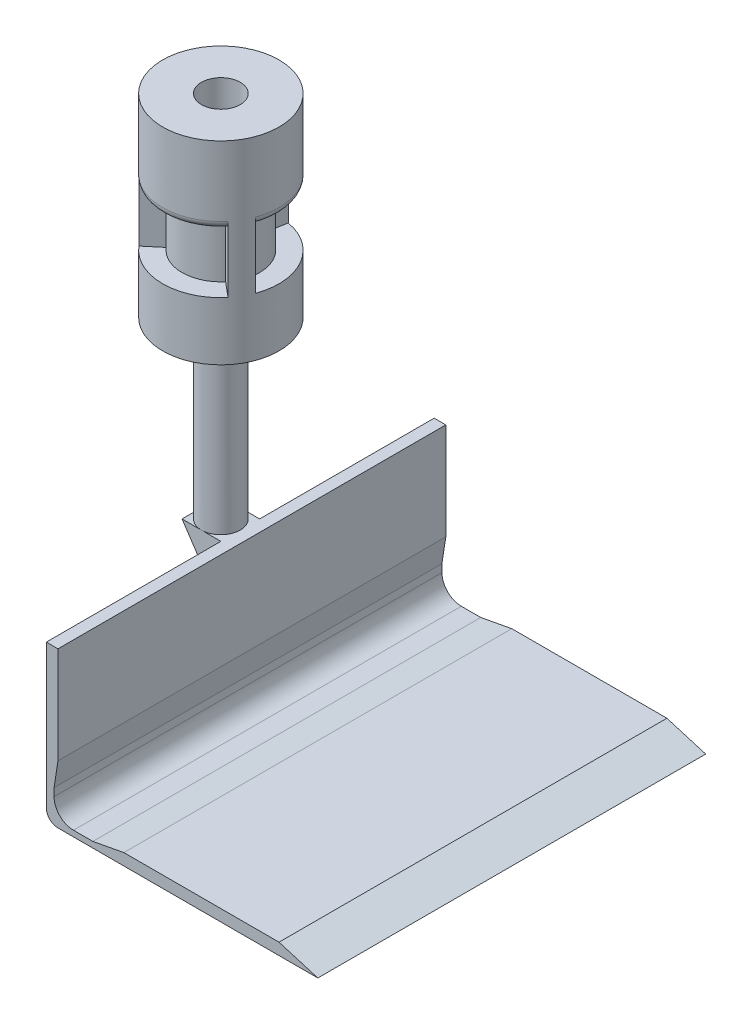
ISO-10303-21;
HEADER;
FILE_DESCRIPTION(('STEP AP214'),'2;1');
FILE_NAME('part.step','',(''),(''),'','','');
FILE_SCHEMA(('AUTOMOTIVE_DESIGN { 1 0 10303 214 1 1 1 1 }'));
ENDSEC;
DATA;
#1=APPLICATION_CONTEXT('core data for automotive mechanical design processes');
#2=APPLICATION_PROTOCOL_DEFINITION('international standard','automotive_design',2000,#1);
#3=PRODUCT_CONTEXT('',#1,'mechanical');
#4=PRODUCT('Part','Part','',(#3));
#5=PRODUCT_RELATED_PRODUCT_CATEGORY('part','',(#4));
#6=PRODUCT_DEFINITION_FORMATION('','',#4);
#7=PRODUCT_DEFINITION_CONTEXT('part definition',#1,'design');
#8=PRODUCT_DEFINITION('design','',#6,#7);
#9=PRODUCT_DEFINITION_SHAPE('','',#8);
#10=(LENGTH_UNIT() NAMED_UNIT(*) SI_UNIT(.MILLI.,.METRE.));
#11=(NAMED_UNIT(*) PLANE_ANGLE_UNIT() SI_UNIT($,.RADIAN.));
#12=(NAMED_UNIT(*) SI_UNIT($,.STERADIAN.) SOLID_ANGLE_UNIT());
#13=UNCERTAINTY_MEASURE_WITH_UNIT(LENGTH_MEASURE(1.E-05),#10,'distance_accuracy_value','');
#14=(GEOMETRIC_REPRESENTATION_CONTEXT(3) GLOBAL_UNCERTAINTY_ASSIGNED_CONTEXT((#13)) GLOBAL_UNIT_ASSIGNED_CONTEXT((#10,
#11,#12)) REPRESENTATION_CONTEXT('',''));
#15=CARTESIAN_POINT('',(0.,0.,0.));
#16=DIRECTION('',(0.,0.,1.));
#17=DIRECTION('',(1.,0.,0.));
#18=AXIS2_PLACEMENT_3D('',#15,#16,#17);
#19=CARTESIAN_POINT('',(7.,100.,0.));
#20=DIRECTION('',(0.,1.,0.));
#21=DIRECTION('',(0.,0.,1.));
#22=AXIS2_PLACEMENT_3D('',#19,#20,#21);
#23=PLANE('',#22);
#24=CARTESIAN_POINT('',(-8.,100.,0.));
#25=DIRECTION('',(0.,-1.,0.));
#26=DIRECTION('',(0.,0.,-1.));
#27=AXIS2_PLACEMENT_3D('',#24,#25,#26);
#28=CIRCLE('',#27,15.);
#29=CARTESIAN_POINT('',(-22.0953893117886,100.,5.1303021498851));
#30=VERTEX_POINT('',#29);
#31=CARTESIAN_POINT('',(-10.604722665004,100.,-14.7721162951831));
#32=VERTEX_POINT('',#31);
#33=EDGE_CURVE('E265',#30,#32,#28,.T.);
#34=ORIENTED_EDGE('',*,*,#33,.F.);
#35=DIRECTION('',(-0.939692620785905,0.,0.342020143325678));
#36=VECTOR('',#35,1.);
#37=CARTESIAN_POINT('',(-15.0476946558945,100.,2.56515107494258));
#38=LINE('',#37,#36);
#39=CARTESIAN_POINT('',(-17.3969262078591,100.,3.42020143325671));
#40=VERTEX_POINT('',#39);
#41=EDGE_CURVE('E249',#40,#30,#38,.T.);
#42=ORIENTED_EDGE('',*,*,#41,.F.);
#43=CARTESIAN_POINT('',(-8.,100.,0.));
#44=DIRECTION('',(0.,-1.,0.));
#45=DIRECTION('',(0.,0.,-1.));
#46=AXIS2_PLACEMENT_3D('',#43,#44,#45);
#47=CIRCLE('',#46,10.);
#48=CARTESIAN_POINT('',(-9.73648177666931,100.,-9.84807753012208));
#49=VERTEX_POINT('',#48);
#50=EDGE_CURVE('E482',#40,#49,#47,.T.);
#51=ORIENTED_EDGE('',*,*,#50,.T.);
#52=DIRECTION('',(0.173648177666931,0.,0.984807753012208));
#53=VECTOR('',#52,1.);
#54=CARTESIAN_POINT('',(-9.30236133250201,100.,-7.38605814759174));
#55=LINE('',#54,#53);
#56=EDGE_CURVE('E525',#32,#49,#55,.T.);
#57=ORIENTED_EDGE('',*,*,#56,.F.);
#58=EDGE_LOOP('',(#34,#42,#51,#57));
#59=FACE_BOUND('',#58,.T.);
#60=ADVANCED_FACE('F33',(#59),#23,.T.);
#61=CARTESIAN_POINT('',(-0.339555568810034,100.,6.42787609686517));
#62=VERTEX_POINT('',#61);
#63=CARTESIAN_POINT('',(-15.6604444311896,100.,6.42787609686556));
#64=VERTEX_POINT('',#63);
#65=EDGE_CURVE('E258',#62,#64,#47,.T.);
#66=ORIENTED_EDGE('',*,*,#65,.T.);
#67=DIRECTION('',(0.766044443118984,0.,-0.642787609686532));
#68=VECTOR('',#67,1.);
#69=CARTESIAN_POINT('',(-13.7453333233921,100.,4.82090707264913));
#70=LINE('',#69,#68);
#71=CARTESIAN_POINT('',(-19.4906666467844,100.,9.64181414529812));
#72=VERTEX_POINT('',#71);
#73=EDGE_CURVE('E240',#72,#64,#70,.T.);
#74=ORIENTED_EDGE('',*,*,#73,.F.);
#75=CARTESIAN_POINT('',(3.49066664678484,100.,9.64181414529789));
#76=VERTEX_POINT('',#75);
#77=EDGE_CURVE('E256',#76,#72,#28,.T.);
#78=ORIENTED_EDGE('',*,*,#77,.F.);
#79=DIRECTION('',(0.766044443118975,0.,0.642787609686544));
#80=VECTOR('',#79,1.);
#81=CARTESIAN_POINT('',(-2.25466667660742,100.,4.82090707264885));
#82=LINE('',#81,#80);
#83=EDGE_CURVE('E540',#62,#76,#82,.T.);
#84=ORIENTED_EDGE('',*,*,#83,.F.);
#85=EDGE_LOOP('',(#66,#74,#78,#84));
#86=FACE_BOUND('',#85,.T.);
#87=ADVANCED_FACE('F254',(#86),#23,.T.);
#88=CARTESIAN_POINT('',(-8.,85.,0.));
#89=DIRECTION('',(0.,-1.,0.));
#90=DIRECTION('',(0.,0.,-1.));
#91=AXIS2_PLACEMENT_3D('',#88,#89,#90);
#92=CYLINDRICAL_SURFACE('',#91,10.);
#93=ORIENTED_EDGE('',*,*,#50,.F.);
#94=DIRECTION('',(0.,-1.,0.));
#95=VECTOR('',#94,1.);
#96=CARTESIAN_POINT('',(-17.3969262078591,85.,3.42020143325671));
#97=LINE('',#96,#95);
#98=CARTESIAN_POINT('',(-17.3969262078591,115.,3.42020143325671));
#99=VERTEX_POINT('',#98);
#100=EDGE_CURVE('E546',#99,#40,#97,.T.);
#101=ORIENTED_EDGE('',*,*,#100,.F.);
#102=CARTESIAN_POINT('',(-8.,115.,0.));
#103=DIRECTION('',(0.,-1.,0.));
#104=DIRECTION('',(0.,0.,-1.));
#105=AXIS2_PLACEMENT_3D('',#102,#103,#104);
#106=CIRCLE('',#105,10.);
#107=CARTESIAN_POINT('',(-9.73648177666931,115.,-9.84807753012208));
#108=VERTEX_POINT('',#107);
#109=EDGE_CURVE('E490',#99,#108,#106,.T.);
#110=ORIENTED_EDGE('',*,*,#109,.T.);
#111=DIRECTION('',(0.,-1.,0.));
#112=VECTOR('',#111,1.);
#113=CARTESIAN_POINT('',(-9.73648177666931,85.,-9.84807753012208));
#114=LINE('',#113,#112);
#115=EDGE_CURVE('E514',#49,#108,#114,.F.);
#116=ORIENTED_EDGE('',*,*,#115,.F.);
#117=EDGE_LOOP('',(#93,#101,#110,#116));
#118=FACE_BOUND('',#117,.T.);
#119=ADVANCED_FACE('F455',(#118),#92,.T.);
#120=CARTESIAN_POINT('',(-0.339555568810035,115.,6.42787609686517));
#121=VERTEX_POINT('',#120);
#122=CARTESIAN_POINT('',(-15.6604444311896,115.,6.42787609686556));
#123=VERTEX_POINT('',#122);
#124=EDGE_CURVE('E489',#121,#123,#106,.T.);
#125=ORIENTED_EDGE('',*,*,#124,.T.);
#126=DIRECTION('',(0.,-1.,0.));
#127=VECTOR('',#126,1.);
#128=CARTESIAN_POINT('',(-15.6604444311896,85.,6.42787609686556));
#129=LINE('',#128,#127);
#130=EDGE_CURVE('E549',#64,#123,#129,.F.);
#131=ORIENTED_EDGE('',*,*,#130,.F.);
#132=ORIENTED_EDGE('',*,*,#65,.F.);
#133=DIRECTION('',(0.,-1.,0.));
#134=VECTOR('',#133,1.);
#135=CARTESIAN_POINT('',(-0.339555568810035,85.,6.42787609686517));
#136=LINE('',#135,#134);
#137=EDGE_CURVE('E531',#121,#62,#136,.T.);
#138=ORIENTED_EDGE('',*,*,#137,.F.);
#139=EDGE_LOOP('',(#125,#131,#132,#138));
#140=FACE_BOUND('',#139,.T.);
#141=ADVANCED_FACE('F469',(#140),#92,.T.);
#142=CARTESIAN_POINT('',(7.,115.,0.));
#143=DIRECTION('',(0.,-1.,0.));
#144=DIRECTION('',(0.,0.,-1.));
#145=AXIS2_PLACEMENT_3D('',#142,#143,#144);
#146=PLANE('',#145);
#147=DIRECTION('',(0.939692620785905,0.,-0.342020143325678));
#148=VECTOR('',#147,1.);
#149=CARTESIAN_POINT('',(-15.0476946558945,115.,2.56515107494258));
#150=LINE('',#149,#148);
#151=CARTESIAN_POINT('',(-20.2160040702168,115.,4.44626186323375));
#152=VERTEX_POINT('',#151);
#153=EDGE_CURVE('E543',#152,#99,#150,.T.);
#154=ORIENTED_EDGE('',*,*,#153,.F.);
#155=CARTESIAN_POINT('',(-8.,115.,0.));
#156=DIRECTION('',(0.,-1.,0.));
#157=DIRECTION('',(0.,0.,-1.));
#158=AXIS2_PLACEMENT_3D('',#155,#156,#157);
#159=CIRCLE('',#158,13.);
#160=CARTESIAN_POINT('',(-10.2574263096701,115.,-12.8025007891587));
#161=VERTEX_POINT('',#160);
#162=EDGE_CURVE('E396',#152,#161,#159,.T.);
#163=ORIENTED_EDGE('',*,*,#162,.T.);
#164=DIRECTION('',(-0.173648177666931,0.,-0.984807753012208));
#165=VECTOR('',#164,1.);
#166=CARTESIAN_POINT('',(-9.30236133250201,115.,-7.38605814759174));
#167=LINE('',#166,#165);
#168=EDGE_CURVE('E513',#108,#161,#167,.T.);
#169=ORIENTED_EDGE('',*,*,#168,.F.);
#170=ORIENTED_EDGE('',*,*,#109,.F.);
#171=EDGE_LOOP('',(#154,#163,#169,#170));
#172=FACE_BOUND('',#171,.T.);
#173=ADVANCED_FACE('F470',(#172),#146,.T.);
#174=DIRECTION('',(-0.766044443118975,0.,-0.642787609686544));
#175=VECTOR('',#174,1.);
#176=CARTESIAN_POINT('',(-2.25466667660742,115.,4.82090707264885));
#177=LINE('',#176,#175);
#178=CARTESIAN_POINT('',(1.9585777605469,115.,8.3562389259248));
#179=VERTEX_POINT('',#178);
#180=EDGE_CURVE('E528',#179,#121,#177,.T.);
#181=ORIENTED_EDGE('',*,*,#180,.F.);
#182=CARTESIAN_POINT('',(-8.,115.,0.));
#183=DIRECTION('',(0.,-1.,0.));
#184=DIRECTION('',(0.,0.,-1.));
#185=AXIS2_PLACEMENT_3D('',#182,#183,#184);
#186=CIRCLE('',#185,13.);
#187=CARTESIAN_POINT('',(-17.9585777605466,115.,8.35623892592517));
#188=VERTEX_POINT('',#187);
#189=EDGE_CURVE('E399',#179,#188,#186,.T.);
#190=ORIENTED_EDGE('',*,*,#189,.T.);
#191=DIRECTION('',(-0.766044443118984,0.,0.642787609686533));
#192=VECTOR('',#191,1.);
#193=CARTESIAN_POINT('',(-13.7453333233921,115.,4.82090707264913));
#194=LINE('',#193,#192);
#195=EDGE_CURVE('E548',#123,#188,#194,.T.);
#196=ORIENTED_EDGE('',*,*,#195,.F.);
#197=ORIENTED_EDGE('',*,*,#124,.F.);
#198=EDGE_LOOP('',(#181,#190,#196,#197));
#199=FACE_BOUND('',#198,.T.);
#200=ADVANCED_FACE('F461',(#199),#146,.T.);
#201=CARTESIAN_POINT('',(-6.2635182233307,100.,-9.84807753012208));
#202=VERTEX_POINT('',#201);
#203=CARTESIAN_POINT('',(1.39692620785917,100.,3.42020143325643));
#204=VERTEX_POINT('',#203);
#205=EDGE_CURVE('E269',#202,#204,#47,.T.);
#206=ORIENTED_EDGE('',*,*,#205,.T.);
#207=DIRECTION('',(-0.939692620785907,0.,-0.342020143325672));
#208=VECTOR('',#207,1.);
#209=CARTESIAN_POINT('',(-0.952305344105427,100.,2.56515107494231));
#210=LINE('',#209,#208);
#211=CARTESIAN_POINT('',(6.09538931178888,100.,5.13030214988485));
#212=VERTEX_POINT('',#211);
#213=EDGE_CURVE('E476',#212,#204,#210,.T.);
#214=ORIENTED_EDGE('',*,*,#213,.F.);
#215=CARTESIAN_POINT('',(-5.39527733499605,100.,-14.7721162951831));
#216=VERTEX_POINT('',#215);
#217=EDGE_CURVE('E264',#216,#212,#28,.T.);
#218=ORIENTED_EDGE('',*,*,#217,.F.);
#219=DIRECTION('',(0.173648177666931,0.,-0.984807753012208));
#220=VECTOR('',#219,1.);
#221=CARTESIAN_POINT('',(-6.69763866749803,100.,-7.38605814759156));
#222=LINE('',#221,#220);
#223=EDGE_CURVE('E478',#202,#216,#222,.T.);
#224=ORIENTED_EDGE('',*,*,#223,.F.);
#225=EDGE_LOOP('',(#206,#214,#218,#224));
#226=FACE_BOUND('',#225,.T.);
#227=ADVANCED_FACE('F451',(#226),#23,.T.);
#228=CARTESIAN_POINT('',(-6.2635182233307,115.,-9.84807753012208));
#229=VERTEX_POINT('',#228);
#230=CARTESIAN_POINT('',(1.39692620785917,115.,3.42020143325643));
#231=VERTEX_POINT('',#230);
#232=EDGE_CURVE('E483',#229,#231,#106,.T.);
#233=ORIENTED_EDGE('',*,*,#232,.T.);
#234=DIRECTION('',(0.,-1.,0.));
#235=VECTOR('',#234,1.);
#236=CARTESIAN_POINT('',(1.39692620785917,85.,3.42020143325643));
#237=LINE('',#236,#235);
#238=EDGE_CURVE('E534',#204,#231,#237,.F.);
#239=ORIENTED_EDGE('',*,*,#238,.F.);
#240=ORIENTED_EDGE('',*,*,#205,.F.);
#241=DIRECTION('',(0.,-1.,0.));
#242=VECTOR('',#241,1.);
#243=CARTESIAN_POINT('',(-6.2635182233307,85.,-9.84807753012208));
#244=LINE('',#243,#242);
#245=EDGE_CURVE('E511',#229,#202,#244,.T.);
#246=ORIENTED_EDGE('',*,*,#245,.F.);
#247=EDGE_LOOP('',(#233,#239,#240,#246));
#248=FACE_BOUND('',#247,.T.);
#249=ADVANCED_FACE('F460',(#248),#92,.T.);
#250=DIRECTION('',(-0.173648177666931,0.,0.984807753012208));
#251=VECTOR('',#250,1.);
#252=CARTESIAN_POINT('',(-6.69763866749803,115.,-7.38605814759156));
#253=LINE('',#252,#251);
#254=CARTESIAN_POINT('',(-5.74257369032991,115.,-12.8025007891587));
#255=VERTEX_POINT('',#254);
#256=EDGE_CURVE('E509',#255,#229,#253,.T.);
#257=ORIENTED_EDGE('',*,*,#256,.F.);
#258=CARTESIAN_POINT('',(-8.,115.,0.));
#259=DIRECTION('',(0.,-1.,0.));
#260=DIRECTION('',(0.,0.,-1.));
#261=AXIS2_PLACEMENT_3D('',#258,#259,#260);
#262=CIRCLE('',#261,13.);
#263=CARTESIAN_POINT('',(4.2160040702169,115.,4.44626186323345));
#264=VERTEX_POINT('',#263);
#265=EDGE_CURVE('E385',#255,#264,#262,.T.);
#266=ORIENTED_EDGE('',*,*,#265,.T.);
#267=DIRECTION('',(0.939692620785907,0.,0.342020143325672));
#268=VECTOR('',#267,1.);
#269=CARTESIAN_POINT('',(-0.952305344105424,115.,2.56515107494231));
#270=LINE('',#269,#268);
#271=EDGE_CURVE('E533',#231,#264,#270,.T.);
#272=ORIENTED_EDGE('',*,*,#271,.F.);
#273=ORIENTED_EDGE('',*,*,#232,.F.);
#274=EDGE_LOOP('',(#257,#266,#272,#273));
#275=FACE_BOUND('',#274,.T.);
#276=ADVANCED_FACE('F467',(#275),#146,.T.);
#277=CARTESIAN_POINT('',(-3.,40.,50.));
#278=DIRECTION('',(0.,-1.,0.));
#279=DIRECTION('',(0.,0.,-1.));
#280=AXIS2_PLACEMENT_3D('',#277,#278,#279);
#281=PLANE('',#280);
#282=DIRECTION('',(-1.,0.,0.));
#283=VECTOR('',#282,1.);
#284=CARTESIAN_POINT('',(-13.,40.,-5.));
#285=LINE('',#284,#283);
#286=CARTESIAN_POINT('',(-3.,40.,-5.));
#287=VERTEX_POINT('',#286);
#288=CARTESIAN_POINT('',(-8.00000000000001,40.,-5.));
#289=VERTEX_POINT('',#288);
#290=EDGE_CURVE('E293',#287,#289,#285,.T.);
#291=ORIENTED_EDGE('',*,*,#290,.T.);
#292=CARTESIAN_POINT('',(-8.00000000000001,40.,0.));
#293=DIRECTION('',(0.,-1.,0.));
#294=DIRECTION('',(0.,0.,-1.));
#295=AXIS2_PLACEMENT_3D('',#292,#293,#294);
#296=CIRCLE('',#295,5.);
#297=CARTESIAN_POINT('',(-8.00000000000001,40.,5.));
#298=VERTEX_POINT('',#297);
#299=EDGE_CURVE('E278',#289,#298,#296,.T.);
#300=ORIENTED_EDGE('',*,*,#299,.T.);
#301=DIRECTION('',(-1.,0.,0.));
#302=VECTOR('',#301,1.);
#303=CARTESIAN_POINT('',(-13.,40.,5.));
#304=LINE('',#303,#302);
#305=CARTESIAN_POINT('',(-3.,40.,5.));
#306=VERTEX_POINT('',#305);
#307=EDGE_CURVE('E284',#306,#298,#304,.T.);
#308=ORIENTED_EDGE('',*,*,#307,.F.);
#309=DIRECTION('',(0.,0.,-1.));
#310=VECTOR('',#309,1.);
#311=CARTESIAN_POINT('',(-3.,40.,50.));
#312=LINE('',#311,#310);
#313=CARTESIAN_POINT('',(-3.,40.,50.));
#314=VERTEX_POINT('',#313);
#315=EDGE_CURVE('E382',#314,#306,#312,.T.);
#316=ORIENTED_EDGE('',*,*,#315,.F.);
#317=DIRECTION('',(-1.,0.,0.));
#318=VECTOR('',#317,1.);
#319=CARTESIAN_POINT('',(-3.,40.,50.));
#320=LINE('',#319,#318);
#321=CARTESIAN_POINT('',(0.,40.,50.));
#322=VERTEX_POINT('',#321);
#323=EDGE_CURVE('E309',#322,#314,#320,.T.);
#324=ORIENTED_EDGE('',*,*,#323,.F.);
#325=DIRECTION('',(0.,0.,-1.));
#326=VECTOR('',#325,1.);
#327=CARTESIAN_POINT('',(0.,40.,50.));
#328=LINE('',#327,#326);
#329=CARTESIAN_POINT('',(0.,40.,-50.));
#330=VERTEX_POINT('',#329);
#331=EDGE_CURVE('E333',#322,#330,#328,.T.);
#332=ORIENTED_EDGE('',*,*,#331,.T.);
#333=DIRECTION('',(-1.,0.,0.));
#334=VECTOR('',#333,1.);
#335=CARTESIAN_POINT('',(-3.,40.,-50.));
#336=LINE('',#335,#334);
#337=CARTESIAN_POINT('',(-3.,40.,-50.));
#338=VERTEX_POINT('',#337);
#339=EDGE_CURVE('E308',#330,#338,#336,.T.);
#340=ORIENTED_EDGE('',*,*,#339,.T.);
#341=EDGE_CURVE('E381',#287,#338,#312,.T.);
#342=ORIENTED_EDGE('',*,*,#341,.F.);
#343=EDGE_LOOP('',(#291,#300,#308,#316,#324,#332,#340,#342));
#344=FACE_BOUND('',#343,.T.);
#345=ADVANCED_FACE('F619',(#344),#281,.F.);
#346=CARTESIAN_POINT('',(-13.,40.,5.));
#347=VERTEX_POINT('',#346);
#348=EDGE_CURVE('E288',#298,#347,#304,.T.);
#349=ORIENTED_EDGE('',*,*,#348,.F.);
#350=CARTESIAN_POINT('',(-13.,40.,0.));
#351=VERTEX_POINT('',#350);
#352=EDGE_CURVE('E282',#298,#351,#296,.T.);
#353=ORIENTED_EDGE('',*,*,#352,.T.);
#354=DIRECTION('',(0.,0.,-1.));
#355=VECTOR('',#354,1.);
#356=CARTESIAN_POINT('',(-13.,40.,5.));
#357=LINE('',#356,#355);
#358=EDGE_CURVE('E305',#347,#351,#357,.T.);
#359=ORIENTED_EDGE('',*,*,#358,.F.);
#360=EDGE_LOOP('',(#349,#353,#359));
#361=FACE_BOUND('',#360,.T.);
#362=ADVANCED_FACE('F617',(#361),#281,.F.);
#363=CARTESIAN_POINT('',(-13.,40.,-5.));
#364=VERTEX_POINT('',#363);
#365=EDGE_CURVE('E304',#351,#364,#357,.T.);
#366=ORIENTED_EDGE('',*,*,#365,.F.);
#367=EDGE_CURVE('E283',#351,#289,#296,.T.);
#368=ORIENTED_EDGE('',*,*,#367,.T.);
#369=EDGE_CURVE('E281',#289,#364,#285,.T.);
#370=ORIENTED_EDGE('',*,*,#369,.T.);
#371=EDGE_LOOP('',(#366,#368,#370));
#372=FACE_BOUND('',#371,.T.);
#373=ADVANCED_FACE('F613',(#372),#281,.F.);
#374=CARTESIAN_POINT('',(-3.,0.,50.));
#375=DIRECTION('',(1.,0.,0.));
#376=DIRECTION('',(0.,0.,-1.));
#377=AXIS2_PLACEMENT_3D('',#374,#375,#376);
#378=PLANE('',#377);
#379=DIRECTION('',(0.,-1.,0.));
#380=VECTOR('',#379,1.);
#381=CARTESIAN_POINT('',(-3.,0.,-50.));
#382=LINE('',#381,#380);
#383=CARTESIAN_POINT('',(-3.,3.,-50.));
#384=VERTEX_POINT('',#383);
#385=EDGE_CURVE('E336',#338,#384,#382,.T.);
#386=ORIENTED_EDGE('',*,*,#385,.T.);
#387=DIRECTION('',(0.,0.,-1.));
#388=VECTOR('',#387,1.);
#389=CARTESIAN_POINT('',(-3.,3.,50.));
#390=LINE('',#389,#388);
#391=CARTESIAN_POINT('',(-3.,3.,50.));
#392=VERTEX_POINT('',#391);
#393=EDGE_CURVE('E41',#384,#392,#390,.F.);
#394=ORIENTED_EDGE('',*,*,#393,.T.);
#395=DIRECTION('',(0.,-1.,0.));
#396=VECTOR('',#395,1.);
#397=CARTESIAN_POINT('',(-3.,0.,50.));
#398=LINE('',#397,#396);
#399=EDGE_CURVE('E312',#314,#392,#398,.T.);
#400=ORIENTED_EDGE('',*,*,#399,.F.);
#401=ORIENTED_EDGE('',*,*,#315,.T.);
#402=DIRECTION('',(0.,1.,0.));
#403=VECTOR('',#402,1.);
#404=CARTESIAN_POINT('',(-3.,25.,5.));
#405=LINE('',#404,#403);
#406=CARTESIAN_POINT('',(-3.,25.,5.));
#407=VERTEX_POINT('',#406);
#408=EDGE_CURVE('E290',#407,#306,#405,.T.);
#409=ORIENTED_EDGE('',*,*,#408,.F.);
#410=DIRECTION('',(0.,0.,-1.));
#411=VECTOR('',#410,1.);
#412=CARTESIAN_POINT('',(-3.,25.,5.));
#413=LINE('',#412,#411);
#414=CARTESIAN_POINT('',(-3.,25.,-5.));
#415=VERTEX_POINT('',#414);
#416=EDGE_CURVE('E292',#407,#415,#413,.T.);
#417=ORIENTED_EDGE('',*,*,#416,.T.);
#418=DIRECTION('',(0.,1.,0.));
#419=VECTOR('',#418,1.);
#420=CARTESIAN_POINT('',(-3.,25.,-5.));
#421=LINE('',#420,#419);
#422=EDGE_CURVE('E299',#415,#287,#421,.T.);
#423=ORIENTED_EDGE('',*,*,#422,.T.);
#424=ORIENTED_EDGE('',*,*,#341,.T.);
#425=EDGE_LOOP('',(#386,#394,#400,#401,#409,#417,#423,#424));
#426=FACE_BOUND('',#425,.T.);
#427=ADVANCED_FACE('F616',(#426),#378,.F.);
#428=CARTESIAN_POINT('',(67.,0.,50.));
#429=DIRECTION('',(0.,1.,0.));
#430=DIRECTION('',(-1.,0.,0.));
#431=AXIS2_PLACEMENT_3D('',#428,#429,#430);
#432=PLANE('',#431);
#433=DIRECTION('',(1.,0.,0.));
#434=VECTOR('',#433,1.);
#435=CARTESIAN_POINT('',(67.,0.,50.));
#436=LINE('',#435,#434);
#437=CARTESIAN_POINT('',(0.,0.,50.));
#438=VERTEX_POINT('',#437);
#439=CARTESIAN_POINT('',(67.,0.,50.));
#440=VERTEX_POINT('',#439);
#441=EDGE_CURVE('E315',#438,#440,#436,.T.);
#442=ORIENTED_EDGE('',*,*,#441,.F.);
#443=DIRECTION('',(0.,0.,-1.));
#444=VECTOR('',#443,1.);
#445=CARTESIAN_POINT('',(0.,0.,50.));
#446=LINE('',#445,#444);
#447=CARTESIAN_POINT('',(0.,0.,-50.));
#448=VERTEX_POINT('',#447);
#449=EDGE_CURVE('E415',#438,#448,#446,.T.);
#450=ORIENTED_EDGE('',*,*,#449,.T.);
#451=DIRECTION('',(1.,0.,0.));
#452=VECTOR('',#451,1.);
#453=CARTESIAN_POINT('',(67.,0.,-50.));
#454=LINE('',#453,#452);
#455=CARTESIAN_POINT('',(67.,0.,-50.));
#456=VERTEX_POINT('',#455);
#457=EDGE_CURVE('E338',#448,#456,#454,.T.);
#458=ORIENTED_EDGE('',*,*,#457,.T.);
#459=DIRECTION('',(0.,0.,-1.));
#460=VECTOR('',#459,1.);
#461=CARTESIAN_POINT('',(67.,0.,50.));
#462=LINE('',#461,#460);
#463=EDGE_CURVE('E378',#440,#456,#462,.T.);
#464=ORIENTED_EDGE('',*,*,#463,.F.);
#465=EDGE_LOOP('',(#442,#450,#458,#464));
#466=FACE_BOUND('',#465,.T.);
#467=ADVANCED_FACE('F421',(#466),#432,.F.);
#468=CARTESIAN_POINT('',(67.,0.,50.));
#469=DIRECTION('',(-0.287347885566345,-0.957826285221152,0.));
#470=DIRECTION('',(0.957826285221152,-0.287347885566345,0.));
#471=AXIS2_PLACEMENT_3D('',#468,#469,#470);
#472=PLANE('',#471);
#473=DIRECTION('',(-0.957826285221152,0.287347885566345,0.));
#474=VECTOR('',#473,1.);
#475=CARTESIAN_POINT('',(67.,0.,-50.));
#476=LINE('',#475,#474);
#477=CARTESIAN_POINT('',(57.,2.99999999999999,-50.));
#478=VERTEX_POINT('',#477);
#479=EDGE_CURVE('E340',#456,#478,#476,.T.);
#480=ORIENTED_EDGE('',*,*,#479,.T.);
#481=DIRECTION('',(0.,0.,-1.));
#482=VECTOR('',#481,1.);
#483=CARTESIAN_POINT('',(57.,2.99999999999999,50.));
#484=LINE('',#483,#482);
#485=CARTESIAN_POINT('',(57.,2.99999999999999,50.));
#486=VERTEX_POINT('',#485);
#487=EDGE_CURVE('E375',#486,#478,#484,.T.);
#488=ORIENTED_EDGE('',*,*,#487,.F.);
#489=DIRECTION('',(-0.957826285221152,0.287347885566345,0.));
#490=VECTOR('',#489,1.);
#491=CARTESIAN_POINT('',(67.,0.,50.));
#492=LINE('',#491,#490);
#493=EDGE_CURVE('E317',#440,#486,#492,.T.);
#494=ORIENTED_EDGE('',*,*,#493,.F.);
#495=ORIENTED_EDGE('',*,*,#463,.T.);
#496=EDGE_LOOP('',(#480,#488,#494,#495));
#497=FACE_BOUND('',#496,.T.);
#498=ADVANCED_FACE('F431',(#497),#472,.F.);
#499=CARTESIAN_POINT('',(17.,2.99999999999999,50.));
#500=DIRECTION('',(0.,-1.,0.));
#501=DIRECTION('',(0.,0.,-1.));
#502=AXIS2_PLACEMENT_3D('',#499,#500,#501);
#503=PLANE('',#502);
#504=DIRECTION('',(-1.,0.,0.));
#505=VECTOR('',#504,1.);
#506=CARTESIAN_POINT('',(17.,2.99999999999999,-50.));
#507=LINE('',#506,#505);
#508=CARTESIAN_POINT('',(17.,2.99999999999999,-50.));
#509=VERTEX_POINT('',#508);
#510=EDGE_CURVE('E342',#478,#509,#507,.T.);
#511=ORIENTED_EDGE('',*,*,#510,.T.);
#512=DIRECTION('',(0.,0.,-1.));
#513=VECTOR('',#512,1.);
#514=CARTESIAN_POINT('',(17.,2.99999999999999,50.));
#515=LINE('',#514,#513);
#516=CARTESIAN_POINT('',(17.,2.99999999999999,50.));
#517=VERTEX_POINT('',#516);
#518=EDGE_CURVE('E372',#517,#509,#515,.T.);
#519=ORIENTED_EDGE('',*,*,#518,.F.);
#520=DIRECTION('',(-1.,0.,0.));
#521=VECTOR('',#520,1.);
#522=CARTESIAN_POINT('',(17.,2.99999999999999,50.));
#523=LINE('',#522,#521);
#524=EDGE_CURVE('E319',#486,#517,#523,.T.);
#525=ORIENTED_EDGE('',*,*,#524,.F.);
#526=ORIENTED_EDGE('',*,*,#487,.T.);
#527=EDGE_LOOP('',(#511,#519,#525,#526));
#528=FACE_BOUND('',#527,.T.);
#529=ADVANCED_FACE('F435',(#528),#503,.F.);
#530=CARTESIAN_POINT('',(9.,1.49999999999999,50.));
#531=DIRECTION('',(0.184288535050185,-0.982872186934322,0.));
#532=DIRECTION('',(0.982872186934322,0.184288535050185,0.));
#533=AXIS2_PLACEMENT_3D('',#530,#531,#532);
#534=PLANE('',#533);
#535=DIRECTION('',(-0.982872186934322,-0.184288535050185,0.));
#536=VECTOR('',#535,1.);
#537=CARTESIAN_POINT('',(9.,1.49999999999999,-50.));
#538=LINE('',#537,#536);
#539=CARTESIAN_POINT('',(9.,1.49999999999999,-50.));
#540=VERTEX_POINT('',#539);
#541=EDGE_CURVE('E344',#509,#540,#538,.T.);
#542=ORIENTED_EDGE('',*,*,#541,.T.);
#543=DIRECTION('',(0.,0.,-1.));
#544=VECTOR('',#543,1.);
#545=CARTESIAN_POINT('',(9.,1.49999999999999,50.));
#546=LINE('',#545,#544);
#547=CARTESIAN_POINT('',(9.,1.49999999999999,50.));
#548=VERTEX_POINT('',#547);
#549=EDGE_CURVE('E369',#548,#540,#546,.T.);
#550=ORIENTED_EDGE('',*,*,#549,.F.);
#551=DIRECTION('',(-0.982872186934322,-0.184288535050185,0.));
#552=VECTOR('',#551,1.);
#553=CARTESIAN_POINT('',(9.,1.49999999999999,50.));
#554=LINE('',#553,#552);
#555=EDGE_CURVE('E321',#517,#548,#554,.T.);
#556=ORIENTED_EDGE('',*,*,#555,.F.);
#557=ORIENTED_EDGE('',*,*,#518,.T.);
#558=EDGE_LOOP('',(#542,#550,#556,#557));
#559=FACE_BOUND('',#558,.T.);
#560=ADVANCED_FACE('F628',(#559),#534,.F.);
#561=CARTESIAN_POINT('',(4.00000000000003,1.49999999999999,50.));
#562=DIRECTION('',(0.,-1.,0.));
#563=DIRECTION('',(0.,0.,-1.));
#564=AXIS2_PLACEMENT_3D('',#561,#562,#563);
#565=PLANE('',#564);
#566=DIRECTION('',(-1.,0.,0.));
#567=VECTOR('',#566,1.);
#568=CARTESIAN_POINT('',(4.00000000000003,1.49999999999999,-50.));
#569=LINE('',#568,#567);
#570=CARTESIAN_POINT('',(4.00000000000003,1.49999999999999,-50.));
#571=VERTEX_POINT('',#570);
#572=EDGE_CURVE('E346',#540,#571,#569,.T.);
#573=ORIENTED_EDGE('',*,*,#572,.T.);
#574=DIRECTION('',(0.,0.,-1.));
#575=VECTOR('',#574,1.);
#576=CARTESIAN_POINT('',(4.00000000000003,1.49999999999999,50.));
#577=LINE('',#576,#575);
#578=CARTESIAN_POINT('',(4.00000000000003,1.49999999999999,50.));
#579=VERTEX_POINT('',#578);
#580=EDGE_CURVE('E366',#579,#571,#577,.T.);
#581=ORIENTED_EDGE('',*,*,#580,.F.);
#582=DIRECTION('',(-1.,0.,0.));
#583=VECTOR('',#582,1.);
#584=CARTESIAN_POINT('',(4.00000000000003,1.49999999999999,50.));
#585=LINE('',#584,#583);
#586=EDGE_CURVE('E323',#548,#579,#585,.T.);
#587=ORIENTED_EDGE('',*,*,#586,.F.);
#588=ORIENTED_EDGE('',*,*,#549,.T.);
#589=EDGE_LOOP('',(#573,#581,#587,#588));
#590=FACE_BOUND('',#589,.T.);
#591=ADVANCED_FACE('F631',(#590),#565,.F.);
#592=CARTESIAN_POINT('',(3.99999999999999,6.49999999999999,50.));
#593=DIRECTION('',(0.,0.,-1.));
#594=DIRECTION('',(-1.,0.,0.));
#595=AXIS2_PLACEMENT_3D('',#592,#593,#594);
#596=CYLINDRICAL_SURFACE('',#595,5.);
#597=CARTESIAN_POINT('',(3.99999999999999,6.49999999999999,-50.));
#598=DIRECTION('',(0.,0.,-1.));
#599=DIRECTION('',(1.,0.,0.));
#600=AXIS2_PLACEMENT_3D('',#597,#598,#599);
#601=CIRCLE('',#600,5.);
#602=CARTESIAN_POINT('',(-1.,6.50000000000003,-50.));
#603=VERTEX_POINT('',#602);
#604=EDGE_CURVE('E348',#571,#603,#601,.T.);
#605=ORIENTED_EDGE('',*,*,#604,.T.);
#606=DIRECTION('',(0.,0.,-1.));
#607=VECTOR('',#606,1.);
#608=CARTESIAN_POINT('',(-1.,6.50000000000003,50.));
#609=LINE('',#608,#607);
#610=CARTESIAN_POINT('',(-1.,6.50000000000003,50.));
#611=VERTEX_POINT('',#610);
#612=EDGE_CURVE('E363',#611,#603,#609,.T.);
#613=ORIENTED_EDGE('',*,*,#612,.F.);
#614=CARTESIAN_POINT('',(3.99999999999999,6.49999999999999,50.));
#615=DIRECTION('',(0.,0.,-1.));
#616=DIRECTION('',(1.,0.,0.));
#617=AXIS2_PLACEMENT_3D('',#614,#615,#616);
#618=CIRCLE('',#617,5.);
#619=EDGE_CURVE('E325',#579,#611,#618,.T.);
#620=ORIENTED_EDGE('',*,*,#619,.F.);
#621=ORIENTED_EDGE('',*,*,#580,.T.);
#622=EDGE_LOOP('',(#605,#613,#620,#621));
#623=FACE_BOUND('',#622,.T.);
#624=ADVANCED_FACE('F635',(#623),#596,.F.);
#625=CARTESIAN_POINT('',(-1.,8.49999999999999,50.));
#626=DIRECTION('',(-1.,0.,0.));
#627=DIRECTION('',(0.,-1.,0.));
#628=AXIS2_PLACEMENT_3D('',#625,#626,#627);
#629=PLANE('',#628);
#630=DIRECTION('',(0.,1.,0.));
#631=VECTOR('',#630,1.);
#632=CARTESIAN_POINT('',(-1.,8.49999999999999,-50.));
#633=LINE('',#632,#631);
#634=CARTESIAN_POINT('',(-1.,8.49999999999999,-50.));
#635=VERTEX_POINT('',#634);
#636=EDGE_CURVE('E350',#603,#635,#633,.T.);
#637=ORIENTED_EDGE('',*,*,#636,.T.);
#638=DIRECTION('',(0.,0.,-1.));
#639=VECTOR('',#638,1.);
#640=CARTESIAN_POINT('',(-1.,8.49999999999999,50.));
#641=LINE('',#640,#639);
#642=CARTESIAN_POINT('',(-1.,8.49999999999999,50.));
#643=VERTEX_POINT('',#642);
#644=EDGE_CURVE('E360',#643,#635,#641,.T.);
#645=ORIENTED_EDGE('',*,*,#644,.F.);
#646=DIRECTION('',(0.,1.,0.));
#647=VECTOR('',#646,1.);
#648=CARTESIAN_POINT('',(-1.,8.49999999999999,50.));
#649=LINE('',#648,#647);
#650=EDGE_CURVE('E327',#611,#643,#649,.T.);
#651=ORIENTED_EDGE('',*,*,#650,.F.);
#652=ORIENTED_EDGE('',*,*,#612,.T.);
#653=EDGE_LOOP('',(#637,#645,#651,#652));
#654=FACE_BOUND('',#653,.T.);
#655=ADVANCED_FACE('F639',(#654),#629,.F.);
#656=CARTESIAN_POINT('',(-1.,8.49999999999999,50.));
#657=DIRECTION('',(-0.988371697650617,0.152057184253942,0.));
#658=DIRECTION('',(-0.152057184253942,-0.988371697650617,0.));
#659=AXIS2_PLACEMENT_3D('',#656,#657,#658);
#660=PLANE('',#659);
#661=DIRECTION('',(0.152057184253942,0.988371697650617,0.));
#662=VECTOR('',#661,1.);
#663=CARTESIAN_POINT('',(-1.,8.49999999999999,-50.));
#664=LINE('',#663,#662);
#665=CARTESIAN_POINT('',(0.,15.,-50.));
#666=VERTEX_POINT('',#665);
#667=EDGE_CURVE('E352',#635,#666,#664,.T.);
#668=ORIENTED_EDGE('',*,*,#667,.T.);
#669=DIRECTION('',(0.,0.,-1.));
#670=VECTOR('',#669,1.);
#671=CARTESIAN_POINT('',(0.,15.,50.));
#672=LINE('',#671,#670);
#673=CARTESIAN_POINT('',(0.,15.,50.));
#674=VERTEX_POINT('',#673);
#675=EDGE_CURVE('E357',#674,#666,#672,.T.);
#676=ORIENTED_EDGE('',*,*,#675,.F.);
#677=DIRECTION('',(0.152057184253942,0.988371697650617,0.));
#678=VECTOR('',#677,1.);
#679=CARTESIAN_POINT('',(-1.,8.49999999999999,50.));
#680=LINE('',#679,#678);
#681=EDGE_CURVE('E329',#643,#674,#680,.T.);
#682=ORIENTED_EDGE('',*,*,#681,.F.);
#683=ORIENTED_EDGE('',*,*,#644,.T.);
#684=EDGE_LOOP('',(#668,#676,#682,#683));
#685=FACE_BOUND('',#684,.T.);
#686=ADVANCED_FACE('F643',(#685),#660,.F.);
#687=CARTESIAN_POINT('',(0.,40.,50.));
#688=DIRECTION('',(-1.,0.,0.));
#689=DIRECTION('',(0.,-1.,0.));
#690=AXIS2_PLACEMENT_3D('',#687,#688,#689);
#691=PLANE('',#690);
#692=DIRECTION('',(0.,1.,0.));
#693=VECTOR('',#692,1.);
#694=CARTESIAN_POINT('',(0.,40.,-50.));
#695=LINE('',#694,#693);
#696=EDGE_CURVE('E313',#666,#330,#695,.T.);
#697=ORIENTED_EDGE('',*,*,#696,.T.);
#698=ORIENTED_EDGE('',*,*,#331,.F.);
#699=DIRECTION('',(0.,1.,0.));
#700=VECTOR('',#699,1.);
#701=CARTESIAN_POINT('',(0.,40.,50.));
#702=LINE('',#701,#700);
#703=EDGE_CURVE('E331',#674,#322,#702,.T.);
#704=ORIENTED_EDGE('',*,*,#703,.F.);
#705=ORIENTED_EDGE('',*,*,#675,.T.);
#706=EDGE_LOOP('',(#697,#698,#704,#705));
#707=FACE_BOUND('',#706,.T.);
#708=ADVANCED_FACE('F647',(#707),#691,.F.);
#709=CARTESIAN_POINT('',(3.99999999999999,6.49999999999999,50.));
#710=DIRECTION('',(0.,0.,1.));
#711=DIRECTION('',(1.,0.,0.));
#712=AXIS2_PLACEMENT_3D('',#709,#710,#711);
#713=PLANE('',#712);
#714=ORIENTED_EDGE('',*,*,#399,.T.);
#715=CARTESIAN_POINT('',(0.,3.,50.));
#716=DIRECTION('',(0.,0.,1.));
#717=DIRECTION('',(1.,0.,0.));
#718=AXIS2_PLACEMENT_3D('',#715,#716,#717);
#719=CIRCLE('',#718,3.);
#720=EDGE_CURVE('E11',#392,#438,#719,.T.);
#721=ORIENTED_EDGE('',*,*,#720,.T.);
#722=ORIENTED_EDGE('',*,*,#441,.T.);
#723=ORIENTED_EDGE('',*,*,#493,.T.);
#724=ORIENTED_EDGE('',*,*,#524,.T.);
#725=ORIENTED_EDGE('',*,*,#555,.T.);
#726=ORIENTED_EDGE('',*,*,#586,.T.);
#727=ORIENTED_EDGE('',*,*,#619,.T.);
#728=ORIENTED_EDGE('',*,*,#650,.T.);
#729=ORIENTED_EDGE('',*,*,#681,.T.);
#730=ORIENTED_EDGE('',*,*,#703,.T.);
#731=ORIENTED_EDGE('',*,*,#323,.T.);
#732=EDGE_LOOP('',(#714,#721,#722,#723,#724,#725,#726,#727,#728,#729,#730,#731));
#733=FACE_BOUND('',#732,.T.);
#734=ADVANCED_FACE('F439',(#733),#713,.T.);
#735=CARTESIAN_POINT('',(3.99999999999999,6.49999999999999,-50.));
#736=DIRECTION('',(0.,0.,1.));
#737=DIRECTION('',(1.,0.,0.));
#738=AXIS2_PLACEMENT_3D('',#735,#736,#737);
#739=PLANE('',#738);
#740=ORIENTED_EDGE('',*,*,#457,.F.);
#741=CARTESIAN_POINT('',(0.,3.,-50.));
#742=DIRECTION('',(0.,0.,1.));
#743=DIRECTION('',(1.,0.,0.));
#744=AXIS2_PLACEMENT_3D('',#741,#742,#743);
#745=CIRCLE('',#744,3.);
#746=EDGE_CURVE('E55',#448,#384,#745,.F.);
#747=ORIENTED_EDGE('',*,*,#746,.T.);
#748=ORIENTED_EDGE('',*,*,#385,.F.);
#749=ORIENTED_EDGE('',*,*,#339,.F.);
#750=ORIENTED_EDGE('',*,*,#696,.F.);
#751=ORIENTED_EDGE('',*,*,#667,.F.);
#752=ORIENTED_EDGE('',*,*,#636,.F.);
#753=ORIENTED_EDGE('',*,*,#604,.F.);
#754=ORIENTED_EDGE('',*,*,#572,.F.);
#755=ORIENTED_EDGE('',*,*,#541,.F.);
#756=ORIENTED_EDGE('',*,*,#510,.F.);
#757=ORIENTED_EDGE('',*,*,#479,.F.);
#758=EDGE_LOOP('',(#740,#747,#748,#749,#750,#751,#752,#753,#754,#755,#756,#757));
#759=FACE_BOUND('',#758,.T.);
#760=ADVANCED_FACE('F426',(#759),#739,.F.);
#761=CARTESIAN_POINT('',(-13.,40.,5.));
#762=DIRECTION('',(0.832050294337844,0.554700196225229,0.));
#763=DIRECTION('',(-0.554700196225229,0.832050294337844,0.));
#764=AXIS2_PLACEMENT_3D('',#761,#762,#763);
#765=PLANE('',#764);
#766=DIRECTION('',(0.554700196225229,-0.832050294337844,0.));
#767=VECTOR('',#766,1.);
#768=CARTESIAN_POINT('',(-13.,40.,-5.));
#769=LINE('',#768,#767);
#770=EDGE_CURVE('E296',#364,#415,#769,.T.);
#771=ORIENTED_EDGE('',*,*,#770,.T.);
#772=ORIENTED_EDGE('',*,*,#416,.F.);
#773=DIRECTION('',(0.554700196225229,-0.832050294337844,0.));
#774=VECTOR('',#773,1.);
#775=CARTESIAN_POINT('',(-13.,40.,5.));
#776=LINE('',#775,#774);
#777=EDGE_CURVE('E287',#347,#407,#776,.T.);
#778=ORIENTED_EDGE('',*,*,#777,.F.);
#779=ORIENTED_EDGE('',*,*,#358,.T.);
#780=ORIENTED_EDGE('',*,*,#365,.T.);
#781=EDGE_LOOP('',(#771,#772,#778,#779,#780));
#782=FACE_BOUND('',#781,.T.);
#783=ADVANCED_FACE('F654',(#782),#765,.F.);
#784=CARTESIAN_POINT('',(0.,0.,5.));
#785=DIRECTION('',(0.,0.,1.));
#786=DIRECTION('',(1.,0.,0.));
#787=AXIS2_PLACEMENT_3D('',#784,#785,#786);
#788=PLANE('',#787);
#789=ORIENTED_EDGE('',*,*,#307,.T.);
#790=ORIENTED_EDGE('',*,*,#348,.T.);
#791=ORIENTED_EDGE('',*,*,#777,.T.);
#792=ORIENTED_EDGE('',*,*,#408,.T.);
#793=EDGE_LOOP('',(#789,#790,#791,#792));
#794=FACE_BOUND('',#793,.T.);
#795=ADVANCED_FACE('F659',(#794),#788,.T.);
#796=CARTESIAN_POINT('',(0.,0.,-5.));
#797=DIRECTION('',(0.,0.,1.));
#798=DIRECTION('',(1.,0.,0.));
#799=AXIS2_PLACEMENT_3D('',#796,#797,#798);
#800=PLANE('',#799);
#801=ORIENTED_EDGE('',*,*,#290,.F.);
#802=ORIENTED_EDGE('',*,*,#422,.F.);
#803=ORIENTED_EDGE('',*,*,#770,.F.);
#804=ORIENTED_EDGE('',*,*,#369,.F.);
#805=EDGE_LOOP('',(#801,#802,#803,#804));
#806=FACE_BOUND('',#805,.T.);
#807=ADVANCED_FACE('F661',(#806),#800,.F.);
#808=CARTESIAN_POINT('',(-8.00000000000001,40.,0.));
#809=DIRECTION('',(0.,-1.,0.));
#810=DIRECTION('',(0.,0.,-1.));
#811=AXIS2_PLACEMENT_3D('',#808,#809,#810);
#812=CYLINDRICAL_SURFACE('',#811,5.);
#813=CARTESIAN_POINT('',(-8.00000000000001,85.,0.));
#814=DIRECTION('',(0.,-1.,0.));
#815=DIRECTION('',(0.,0.,-1.));
#816=AXIS2_PLACEMENT_3D('',#813,#814,#815);
#817=CIRCLE('',#816,5.);
#818=CARTESIAN_POINT('',(-8.00000000000001,85.,-5.));
#819=VERTEX_POINT('',#818);
#820=EDGE_CURVE('E275',#819,#819,#817,.T.);
#821=ORIENTED_EDGE('',*,*,#820,.T.);
#822=EDGE_LOOP('',(#821));
#823=FACE_BOUND('',#822,.T.);
#824=ORIENTED_EDGE('',*,*,#299,.F.);
#825=ORIENTED_EDGE('',*,*,#367,.F.);
#826=ORIENTED_EDGE('',*,*,#352,.F.);
#827=EDGE_LOOP('',(#824,#825,#826));
#828=FACE_BOUND('',#827,.T.);
#829=ADVANCED_FACE('F664',(#823,#828),#812,.T.);
#830=CARTESIAN_POINT('',(-8.,85.,0.));
#831=DIRECTION('',(0.,-1.,0.));
#832=DIRECTION('',(0.,0.,-1.));
#833=AXIS2_PLACEMENT_3D('',#830,#831,#832);
#834=PLANE('',#833);
#835=ORIENTED_EDGE('',*,*,#820,.F.);
#836=EDGE_LOOP('',(#835));
#837=FACE_BOUND('',#836,.T.);
#838=CARTESIAN_POINT('',(-8.,85.,0.));
#839=DIRECTION('',(0.,-1.,0.));
#840=DIRECTION('',(0.,0.,-1.));
#841=AXIS2_PLACEMENT_3D('',#838,#839,#840);
#842=CIRCLE('',#841,15.);
#843=CARTESIAN_POINT('',(-8.,85.,-15.));
#844=VERTEX_POINT('',#843);
#845=EDGE_CURVE('E268',#844,#844,#842,.T.);
#846=ORIENTED_EDGE('',*,*,#845,.T.);
#847=EDGE_LOOP('',(#846));
#848=FACE_BOUND('',#847,.T.);
#849=ADVANCED_FACE('F671',(#837,#848),#834,.T.);
#850=CARTESIAN_POINT('',(-8.,85.,0.));
#851=DIRECTION('',(0.,-1.,0.));
#852=DIRECTION('',(0.,0.,-1.));
#853=AXIS2_PLACEMENT_3D('',#850,#851,#852);
#854=CYLINDRICAL_SURFACE('',#853,15.);
#855=DIRECTION('',(0.,-1.,0.));
#856=VECTOR('',#855,1.);
#857=CARTESIAN_POINT('',(-10.604722665004,135.002,-14.7721162951831));
#858=LINE('',#857,#856);
#859=CARTESIAN_POINT('',(-10.604722665004,117.,-14.7721162951831));
#860=VERTEX_POINT('',#859);
#861=EDGE_CURVE('E520',#860,#32,#858,.T.);
#862=ORIENTED_EDGE('',*,*,#861,.F.);
#863=CARTESIAN_POINT('',(-8.,117.,0.));
#864=DIRECTION('',(0.,-1.,0.));
#865=DIRECTION('',(0.,0.,-1.));
#866=AXIS2_PLACEMENT_3D('',#863,#864,#865);
#867=CIRCLE('',#866,15.);
#868=CARTESIAN_POINT('',(-22.0953893117884,117.,5.13030214988503));
#869=VERTEX_POINT('',#868);
#870=EDGE_CURVE('E390',#860,#869,#867,.F.);
#871=ORIENTED_EDGE('',*,*,#870,.T.);
#872=DIRECTION('',(0.,-1.,0.));
#873=VECTOR('',#872,1.);
#874=CARTESIAN_POINT('',(-22.0953893117884,135.002,5.13030214988503));
#875=LINE('',#874,#873);
#876=EDGE_CURVE('E248',#869,#30,#875,.T.);
#877=ORIENTED_EDGE('',*,*,#876,.T.);
#878=ORIENTED_EDGE('',*,*,#33,.T.);
#879=EDGE_LOOP('',(#862,#871,#877,#878));
#880=FACE_BOUND('',#879,.T.);
#881=DIRECTION('',(0.,-1.,0.));
#882=VECTOR('',#881,1.);
#883=CARTESIAN_POINT('',(-19.4906666467844,135.002,9.64181414529812));
#884=LINE('',#883,#882);
#885=CARTESIAN_POINT('',(-19.4906666467846,117.,9.64181414529823));
#886=VERTEX_POINT('',#885);
#887=EDGE_CURVE('E237',#886,#72,#884,.T.);
#888=ORIENTED_EDGE('',*,*,#887,.F.);
#889=CARTESIAN_POINT('',(-8.,117.,0.));
#890=DIRECTION('',(0.,-1.,0.));
#891=DIRECTION('',(0.,0.,-1.));
#892=AXIS2_PLACEMENT_3D('',#889,#890,#891);
#893=CIRCLE('',#892,15.);
#894=CARTESIAN_POINT('',(3.49066664678493,117.,9.64181414529796));
#895=VERTEX_POINT('',#894);
#896=EDGE_CURVE('E388',#886,#895,#893,.F.);
#897=ORIENTED_EDGE('',*,*,#896,.T.);
#898=DIRECTION('',(0.,-1.,0.));
#899=VECTOR('',#898,1.);
#900=CARTESIAN_POINT('',(3.49066664678493,135.002,9.64181414529796));
#901=LINE('',#900,#899);
#902=EDGE_CURVE('E263',#895,#76,#901,.T.);
#903=ORIENTED_EDGE('',*,*,#902,.T.);
#904=ORIENTED_EDGE('',*,*,#77,.T.);
#905=EDGE_LOOP('',(#888,#897,#903,#904));
#906=FACE_BOUND('',#905,.T.);
#907=DIRECTION('',(0.,-1.,0.));
#908=VECTOR('',#907,1.);
#909=CARTESIAN_POINT('',(6.09538931178888,135.002,5.13030214988485));
#910=LINE('',#909,#908);
#911=CARTESIAN_POINT('',(6.09538931178872,117.,5.1303021498848));
#912=VERTEX_POINT('',#911);
#913=EDGE_CURVE('E538',#912,#212,#910,.T.);
#914=ORIENTED_EDGE('',*,*,#913,.F.);
#915=CARTESIAN_POINT('',(-8.,117.,0.));
#916=DIRECTION('',(0.,-1.,0.));
#917=DIRECTION('',(0.,0.,-1.));
#918=AXIS2_PLACEMENT_3D('',#915,#916,#917);
#919=CIRCLE('',#918,15.);
#920=CARTESIAN_POINT('',(-5.39527733499605,117.,-14.7721162951831));
#921=VERTEX_POINT('',#920);
#922=EDGE_CURVE('E393',#912,#921,#919,.F.);
#923=ORIENTED_EDGE('',*,*,#922,.T.);
#924=DIRECTION('',(0.,-1.,0.));
#925=VECTOR('',#924,1.);
#926=CARTESIAN_POINT('',(-5.39527733499605,135.002,-14.7721162951831));
#927=LINE('',#926,#925);
#928=EDGE_CURVE('E517',#921,#216,#927,.T.);
#929=ORIENTED_EDGE('',*,*,#928,.T.);
#930=ORIENTED_EDGE('',*,*,#217,.T.);
#931=EDGE_LOOP('',(#914,#923,#929,#930));
#932=FACE_BOUND('',#931,.T.);
#933=ORIENTED_EDGE('',*,*,#845,.F.);
#934=EDGE_LOOP('',(#933));
#935=FACE_BOUND('',#934,.T.);
#936=CARTESIAN_POINT('',(-8.,135.,0.));
#937=DIRECTION('',(0.,-1.,0.));
#938=DIRECTION('',(0.,0.,-1.));
#939=AXIS2_PLACEMENT_3D('',#936,#937,#938);
#940=CIRCLE('',#939,15.);
#941=CARTESIAN_POINT('',(-8.,135.,-15.));
#942=VERTEX_POINT('',#941);
#943=EDGE_CURVE('E494',#942,#942,#940,.T.);
#944=ORIENTED_EDGE('',*,*,#943,.T.);
#945=EDGE_LOOP('',(#944));
#946=FACE_BOUND('',#945,.T.);
#947=ADVANCED_FACE('F261',(#880,#906,#932,#935,#946),#854,.T.);
#948=CARTESIAN_POINT('',(6.99999999999999,135.,0.));
#949=DIRECTION('',(0.,1.,0.));
#950=DIRECTION('',(0.,0.,1.));
#951=AXIS2_PLACEMENT_3D('',#948,#949,#950);
#952=PLANE('',#951);
#953=CARTESIAN_POINT('',(-8.,135.,0.));
#954=DIRECTION('',(0.,-1.,0.));
#955=DIRECTION('',(0.,0.,-1.));
#956=AXIS2_PLACEMENT_3D('',#953,#954,#955);
#957=CIRCLE('',#956,5.);
#958=CARTESIAN_POINT('',(-8.,135.,-5.));
#959=VERTEX_POINT('',#958);
#960=EDGE_CURVE('E500',#959,#959,#957,.T.);
#961=ORIENTED_EDGE('',*,*,#960,.T.);
#962=EDGE_LOOP('',(#961));
#963=FACE_BOUND('',#962,.T.);
#964=ORIENTED_EDGE('',*,*,#943,.F.);
#965=EDGE_LOOP('',(#964));
#966=FACE_BOUND('',#965,.T.);
#967=ADVANCED_FACE('F572',(#963,#966),#952,.T.);
#968=CARTESIAN_POINT('',(-8.,85.,0.));
#969=DIRECTION('',(0.,-1.,0.));
#970=DIRECTION('',(0.,0.,-1.));
#971=AXIS2_PLACEMENT_3D('',#968,#969,#970);
#972=CYLINDRICAL_SURFACE('',#971,5.);
#973=CARTESIAN_POINT('',(-8.,95.,0.));
#974=DIRECTION('',(0.,-1.,0.));
#975=DIRECTION('',(0.,0.,-1.));
#976=AXIS2_PLACEMENT_3D('',#973,#974,#975);
#977=CIRCLE('',#976,5.00000000000001);
#978=CARTESIAN_POINT('',(-8.,95.,-5.00000000000001));
#979=VERTEX_POINT('',#978);
#980=EDGE_CURVE('E504',#979,#979,#977,.T.);
#981=ORIENTED_EDGE('',*,*,#980,.T.);
#982=EDGE_LOOP('',(#981));
#983=FACE_BOUND('',#982,.T.);
#984=ORIENTED_EDGE('',*,*,#960,.F.);
#985=EDGE_LOOP('',(#984));
#986=FACE_BOUND('',#985,.T.);
#987=ADVANCED_FACE('F575',(#983,#986),#972,.F.);
#988=CARTESIAN_POINT('',(-8.,95.,0.));
#989=DIRECTION('',(0.,1.,0.));
#990=DIRECTION('',(0.,0.,1.));
#991=AXIS2_PLACEMENT_3D('',#988,#989,#990);
#992=PLANE('',#991);
#993=ORIENTED_EDGE('',*,*,#980,.F.);
#994=EDGE_LOOP('',(#993));
#995=FACE_BOUND('',#994,.T.);
#996=ADVANCED_FACE('F579',(#995),#992,.T.);
#997=CARTESIAN_POINT('',(-6.69763866749803,135.002,-7.38605814759156));
#998=DIRECTION('',(-0.984807753012208,0.,-0.173648177666931));
#999=DIRECTION('',(-0.173648177666931,0.,0.984807753012208));
#1000=AXIS2_PLACEMENT_3D('',#997,#998,#999);
#1001=PLANE('',#1000);
#1002=ORIENTED_EDGE('',*,*,#928,.F.);
#1003=CARTESIAN_POINT('',(-5.7425736903299,117.,-12.8025007891587));
#1004=DIRECTION('',(-0.984807753012208,0.,-0.173648177666931));
#1005=DIRECTION('',(-0.173648177666931,0.,0.984807753012208));
#1006=AXIS2_PLACEMENT_3D('',#1003,#1004,#1005);
#1007=CIRCLE('',#1006,2.);
#1008=EDGE_CURVE('E405',#921,#255,#1007,.T.);
#1009=ORIENTED_EDGE('',*,*,#1008,.T.);
#1010=ORIENTED_EDGE('',*,*,#256,.T.);
#1011=ORIENTED_EDGE('',*,*,#245,.T.);
#1012=ORIENTED_EDGE('',*,*,#223,.T.);
#1013=EDGE_LOOP('',(#1002,#1009,#1010,#1011,#1012));
#1014=FACE_BOUND('',#1013,.T.);
#1015=ADVANCED_FACE('F583',(#1014),#1001,.F.);
#1016=CARTESIAN_POINT('',(-9.30236133250201,135.002,-7.38605814759174));
#1017=DIRECTION('',(0.984807753012208,0.,-0.173648177666931));
#1018=DIRECTION('',(-0.173648177666931,0.,-0.984807753012208));
#1019=AXIS2_PLACEMENT_3D('',#1016,#1017,#1018);
#1020=PLANE('',#1019);
#1021=ORIENTED_EDGE('',*,*,#115,.T.);
#1022=ORIENTED_EDGE('',*,*,#168,.T.);
#1023=CARTESIAN_POINT('',(-10.2574263096701,117.,-12.8025007891587));
#1024=DIRECTION('',(0.984807753012208,0.,-0.173648177666931));
#1025=DIRECTION('',(-0.173648177666931,0.,-0.984807753012208));
#1026=AXIS2_PLACEMENT_3D('',#1023,#1024,#1025);
#1027=CIRCLE('',#1026,2.);
#1028=EDGE_CURVE('E407',#161,#860,#1027,.T.);
#1029=ORIENTED_EDGE('',*,*,#1028,.T.);
#1030=ORIENTED_EDGE('',*,*,#861,.T.);
#1031=ORIENTED_EDGE('',*,*,#56,.T.);
#1032=EDGE_LOOP('',(#1021,#1022,#1029,#1030,#1031));
#1033=FACE_BOUND('',#1032,.T.);
#1034=ADVANCED_FACE('F560',(#1033),#1020,.F.);
#1035=CARTESIAN_POINT('',(-2.25466667660742,135.002,4.82090707264885));
#1036=DIRECTION('',(0.642787609686543,0.,-0.766044443118974));
#1037=DIRECTION('',(-0.766044443118975,0.,-0.642787609686544));
#1038=AXIS2_PLACEMENT_3D('',#1035,#1036,#1037);
#1039=PLANE('',#1038);
#1040=ORIENTED_EDGE('',*,*,#902,.F.);
#1041=CARTESIAN_POINT('',(1.95857776054667,117.,8.35623892592507));
#1042=DIRECTION('',(0.642787609686543,0.,-0.766044443118974));
#1043=DIRECTION('',(-0.766044443118975,0.,-0.642787609686544));
#1044=AXIS2_PLACEMENT_3D('',#1041,#1042,#1043);
#1045=CIRCLE('',#1044,2.);
#1046=EDGE_CURVE('E413',#895,#179,#1045,.T.);
#1047=ORIENTED_EDGE('',*,*,#1046,.T.);
#1048=ORIENTED_EDGE('',*,*,#180,.T.);
#1049=ORIENTED_EDGE('',*,*,#137,.T.);
#1050=ORIENTED_EDGE('',*,*,#83,.T.);
#1051=EDGE_LOOP('',(#1040,#1047,#1048,#1049,#1050));
#1052=FACE_BOUND('',#1051,.T.);
#1053=ADVANCED_FACE('F587',(#1052),#1039,.F.);
#1054=CARTESIAN_POINT('',(-0.952305344105423,135.002,2.56515107494231));
#1055=DIRECTION('',(-0.342020143325672,0.,0.939692620785907));
#1056=DIRECTION('',(0.939692620785907,0.,0.342020143325672));
#1057=AXIS2_PLACEMENT_3D('',#1054,#1055,#1056);
#1058=PLANE('',#1057);
#1059=ORIENTED_EDGE('',*,*,#238,.T.);
#1060=ORIENTED_EDGE('',*,*,#271,.T.);
#1061=CARTESIAN_POINT('',(4.2160040702168,117.,4.44626186323374));
#1062=DIRECTION('',(-0.342020143325672,0.,0.939692620785907));
#1063=DIRECTION('',(0.939692620785907,0.,0.342020143325672));
#1064=AXIS2_PLACEMENT_3D('',#1061,#1062,#1063);
#1065=CIRCLE('',#1064,2.);
#1066=EDGE_CURVE('E402',#264,#912,#1065,.T.);
#1067=ORIENTED_EDGE('',*,*,#1066,.T.);
#1068=ORIENTED_EDGE('',*,*,#913,.T.);
#1069=ORIENTED_EDGE('',*,*,#213,.T.);
#1070=EDGE_LOOP('',(#1059,#1060,#1067,#1068,#1069));
#1071=FACE_BOUND('',#1070,.T.);
#1072=ADVANCED_FACE('F591',(#1071),#1058,.F.);
#1073=CARTESIAN_POINT('',(-15.0476946558945,135.002,2.56515107494258));
#1074=DIRECTION('',(0.342020143325678,0.,0.939692620785905));
#1075=DIRECTION('',(0.939692620785905,0.,-0.342020143325678));
#1076=AXIS2_PLACEMENT_3D('',#1073,#1074,#1075);
#1077=PLANE('',#1076);
#1078=ORIENTED_EDGE('',*,*,#876,.F.);
#1079=CARTESIAN_POINT('',(-20.2160040702168,117.,4.44626186323382));
#1080=DIRECTION('',(0.342020143325678,0.,0.939692620785905));
#1081=DIRECTION('',(0.939692620785905,0.,-0.342020143325678));
#1082=AXIS2_PLACEMENT_3D('',#1079,#1080,#1081);
#1083=CIRCLE('',#1082,2.);
#1084=EDGE_CURVE('E410',#869,#152,#1083,.T.);
#1085=ORIENTED_EDGE('',*,*,#1084,.T.);
#1086=ORIENTED_EDGE('',*,*,#153,.T.);
#1087=ORIENTED_EDGE('',*,*,#100,.T.);
#1088=ORIENTED_EDGE('',*,*,#41,.T.);
#1089=EDGE_LOOP('',(#1078,#1085,#1086,#1087,#1088));
#1090=FACE_BOUND('',#1089,.T.);
#1091=ADVANCED_FACE('F555',(#1090),#1077,.F.);
#1092=CARTESIAN_POINT('',(-13.7453333233921,135.002,4.82090707264913));
#1093=DIRECTION('',(-0.642787609686532,0.,-0.766044443118984));
#1094=DIRECTION('',(-0.766044443118984,0.,0.642787609686533));
#1095=AXIS2_PLACEMENT_3D('',#1092,#1093,#1094);
#1096=PLANE('',#1095);
#1097=ORIENTED_EDGE('',*,*,#130,.T.);
#1098=ORIENTED_EDGE('',*,*,#195,.T.);
#1099=CARTESIAN_POINT('',(-17.9585777605468,117.,8.35623892592493));
#1100=DIRECTION('',(-0.642787609686532,0.,-0.766044443118984));
#1101=DIRECTION('',(-0.766044443118984,0.,0.642787609686533));
#1102=AXIS2_PLACEMENT_3D('',#1099,#1100,#1101);
#1103=CIRCLE('',#1102,2.);
#1104=EDGE_CURVE('E243',#188,#886,#1103,.T.);
#1105=ORIENTED_EDGE('',*,*,#1104,.T.);
#1106=ORIENTED_EDGE('',*,*,#887,.T.);
#1107=ORIENTED_EDGE('',*,*,#73,.T.);
#1108=EDGE_LOOP('',(#1097,#1098,#1105,#1106,#1107));
#1109=FACE_BOUND('',#1108,.T.);
#1110=ADVANCED_FACE('F239',(#1109),#1096,.F.);
#1111=CARTESIAN_POINT('',(-8.,117.,0.));
#1112=DIRECTION('',(0.,-1.,0.));
#1113=DIRECTION('',(0.,0.,-1.));
#1114=AXIS2_PLACEMENT_3D('',#1111,#1112,#1113);
#1115=TOROIDAL_SURFACE('',#1114,13.,2.);
#1116=ORIENTED_EDGE('',*,*,#1008,.F.);
#1117=ORIENTED_EDGE('',*,*,#922,.F.);
#1118=ORIENTED_EDGE('',*,*,#1066,.F.);
#1119=ORIENTED_EDGE('',*,*,#265,.F.);
#1120=EDGE_LOOP('',(#1116,#1117,#1118,#1119));
#1121=FACE_BOUND('',#1120,.T.);
#1122=ADVANCED_FACE('F600',(#1121),#1115,.T.);
#1123=CARTESIAN_POINT('',(-8.,117.,0.));
#1124=DIRECTION('',(0.,-1.,0.));
#1125=DIRECTION('',(0.,0.,-1.));
#1126=AXIS2_PLACEMENT_3D('',#1123,#1124,#1125);
#1127=TOROIDAL_SURFACE('',#1126,13.,2.);
#1128=ORIENTED_EDGE('',*,*,#1084,.F.);
#1129=ORIENTED_EDGE('',*,*,#870,.F.);
#1130=ORIENTED_EDGE('',*,*,#1028,.F.);
#1131=ORIENTED_EDGE('',*,*,#162,.F.);
#1132=EDGE_LOOP('',(#1128,#1129,#1130,#1131));
#1133=FACE_BOUND('',#1132,.T.);
#1134=ADVANCED_FACE('F446',(#1133),#1127,.T.);
#1135=CARTESIAN_POINT('',(-8.,117.,0.));
#1136=DIRECTION('',(0.,-1.,0.));
#1137=DIRECTION('',(0.,0.,-1.));
#1138=AXIS2_PLACEMENT_3D('',#1135,#1136,#1137);
#1139=TOROIDAL_SURFACE('',#1138,13.,2.);
#1140=ORIENTED_EDGE('',*,*,#1046,.F.);
#1141=ORIENTED_EDGE('',*,*,#896,.F.);
#1142=ORIENTED_EDGE('',*,*,#1104,.F.);
#1143=ORIENTED_EDGE('',*,*,#189,.F.);
#1144=EDGE_LOOP('',(#1140,#1141,#1142,#1143));
#1145=FACE_BOUND('',#1144,.T.);
#1146=ADVANCED_FACE('F442',(#1145),#1139,.T.);
#1147=CARTESIAN_POINT('',(0.,3.,50.));
#1148=DIRECTION('',(0.,0.,-1.));
#1149=DIRECTION('',(-1.,0.,0.));
#1150=AXIS2_PLACEMENT_3D('',#1147,#1148,#1149);
#1151=CYLINDRICAL_SURFACE('',#1150,3.);
#1152=ORIENTED_EDGE('',*,*,#720,.F.);
#1153=ORIENTED_EDGE('',*,*,#393,.F.);
#1154=ORIENTED_EDGE('',*,*,#746,.F.);
#1155=ORIENTED_EDGE('',*,*,#449,.F.);
#1156=EDGE_LOOP('',(#1152,#1153,#1154,#1155));
#1157=FACE_BOUND('',#1156,.T.);
#1158=ADVANCED_FACE('F35',(#1157),#1151,.T.);
#1159=CLOSED_SHELL('',(#60,#87,#119,#141,#173,#200,#227,#249,#276,#345,#362,#373,#427,#467,#498,
#529,#560,#591,#624,#655,#686,#708,#734,#760,#783,#795,#807,#829,#849,#947,#967,#987,#996,#1015,
#1034,#1053,#1072,#1091,#1110,#1122,#1134,#1146,#1158));
#1160=MANIFOLD_SOLID_BREP('B2',#1159);
#1161=ADVANCED_BREP_SHAPE_REPRESENTATION('',(#18,#1160),#14);
#1162=SHAPE_DEFINITION_REPRESENTATION(#9,#1161);
ENDSEC;
END-ISO-10303-21;
